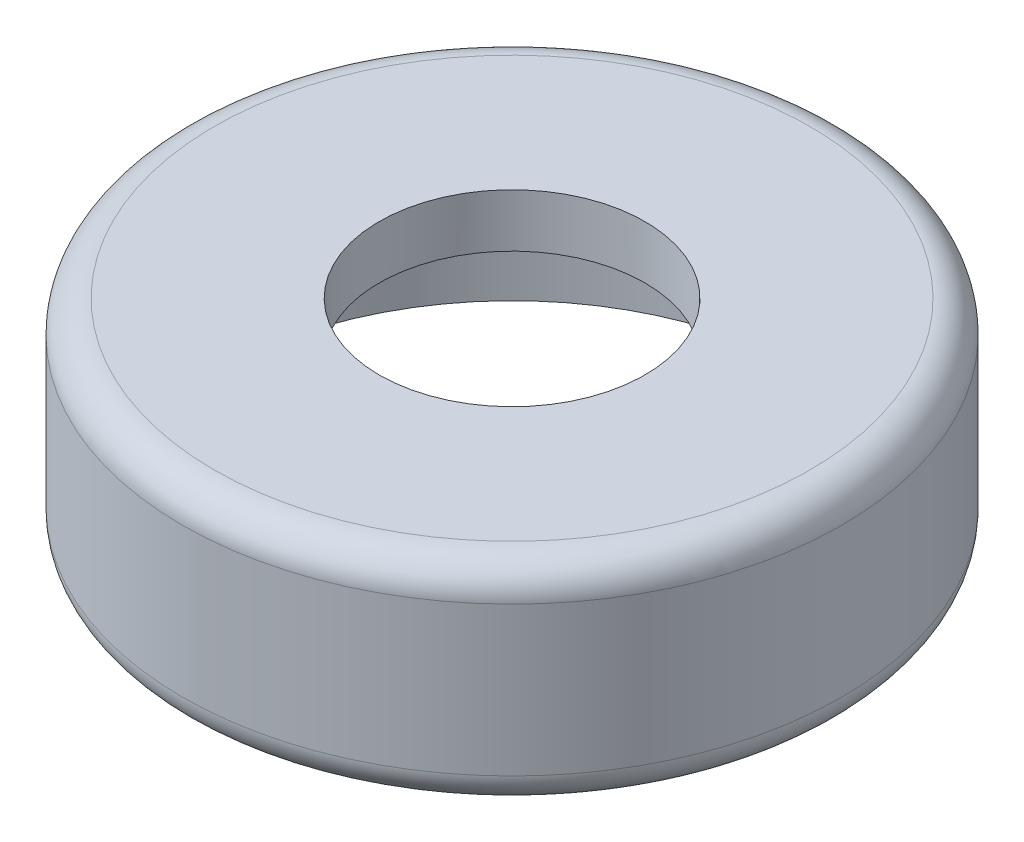
ISO-10303-21;
HEADER;
FILE_DESCRIPTION(('STEP AP214'),'2;1');
FILE_NAME('part.step','',(''),(''),'','','');
FILE_SCHEMA(('AUTOMOTIVE_DESIGN { 1 0 10303 214 1 1 1 1 }'));
ENDSEC;
DATA;
#1=APPLICATION_CONTEXT('core data for automotive mechanical design processes');
#2=APPLICATION_PROTOCOL_DEFINITION('international standard','automotive_design',2000,#1);
#3=PRODUCT_CONTEXT('',#1,'mechanical');
#4=PRODUCT('Part','Part','',(#3));
#5=PRODUCT_RELATED_PRODUCT_CATEGORY('part','',(#4));
#6=PRODUCT_DEFINITION_FORMATION('','',#4);
#7=PRODUCT_DEFINITION_CONTEXT('part definition',#1,'design');
#8=PRODUCT_DEFINITION('design','',#6,#7);
#9=PRODUCT_DEFINITION_SHAPE('','',#8);
#10=(LENGTH_UNIT() NAMED_UNIT(*) SI_UNIT(.MILLI.,.METRE.));
#11=(NAMED_UNIT(*) PLANE_ANGLE_UNIT() SI_UNIT($,.RADIAN.));
#12=(NAMED_UNIT(*) SI_UNIT($,.STERADIAN.) SOLID_ANGLE_UNIT());
#13=UNCERTAINTY_MEASURE_WITH_UNIT(LENGTH_MEASURE(1.E-05),#10,'distance_accuracy_value','');
#14=(GEOMETRIC_REPRESENTATION_CONTEXT(3) GLOBAL_UNCERTAINTY_ASSIGNED_CONTEXT((#13)) GLOBAL_UNIT_ASSIGNED_CONTEXT((#10,
#11,#12)) REPRESENTATION_CONTEXT('',''));
#15=CARTESIAN_POINT('',(0.,0.,0.));
#16=DIRECTION('',(0.,0.,1.));
#17=DIRECTION('',(1.,0.,0.));
#18=AXIS2_PLACEMENT_3D('',#15,#16,#17);
#19=CARTESIAN_POINT('',(0.,20.,0.));
#20=DIRECTION('',(0.,-1.,0.));
#21=DIRECTION('',(0.,0.,-1.));
#22=AXIS2_PLACEMENT_3D('',#19,#20,#21);
#23=CYLINDRICAL_SURFACE('',#22,31.);
#24=CARTESIAN_POINT('',(0.,17.,0.));
#25=DIRECTION('',(0.,1.,0.));
#26=DIRECTION('',(0.,0.,1.));
#27=AXIS2_PLACEMENT_3D('',#24,#25,#26);
#28=CIRCLE('',#27,31.);
#29=CARTESIAN_POINT('',(0.,17.,31.));
#30=VERTEX_POINT('',#29);
#31=EDGE_CURVE('E10',#30,#30,#28,.F.);
#32=ORIENTED_EDGE('',*,*,#31,.T.);
#33=EDGE_LOOP('',(#32));
#34=FACE_BOUND('',#33,.T.);
#35=CARTESIAN_POINT('',(0.,3.,0.));
#36=DIRECTION('',(0.,1.,0.));
#37=DIRECTION('',(0.,0.,1.));
#38=AXIS2_PLACEMENT_3D('',#35,#36,#37);
#39=CIRCLE('',#38,31.);
#40=CARTESIAN_POINT('',(0.,3.,31.));
#41=VERTEX_POINT('',#40);
#42=EDGE_CURVE('E40',#41,#41,#39,.T.);
#43=ORIENTED_EDGE('',*,*,#42,.T.);
#44=EDGE_LOOP('',(#43));
#45=FACE_BOUND('',#44,.T.);
#46=ADVANCED_FACE('F32',(#34,#45),#23,.T.);
#47=CARTESIAN_POINT('',(0.,20.,0.));
#48=DIRECTION('',(0.,1.,0.));
#49=DIRECTION('',(0.,0.,1.));
#50=AXIS2_PLACEMENT_3D('',#47,#48,#49);
#51=PLANE('',#50);
#52=CARTESIAN_POINT('',(0.,20.,0.));
#53=DIRECTION('',(0.,1.,0.));
#54=DIRECTION('',(0.,0.,1.));
#55=AXIS2_PLACEMENT_3D('',#52,#53,#54);
#56=CIRCLE('',#55,12.5);
#57=CARTESIAN_POINT('',(0.,20.,12.5));
#58=VERTEX_POINT('',#57);
#59=EDGE_CURVE('E53',#58,#58,#56,.T.);
#60=ORIENTED_EDGE('',*,*,#59,.F.);
#61=EDGE_LOOP('',(#60));
#62=FACE_BOUND('',#61,.T.);
#63=CARTESIAN_POINT('',(0.,20.,0.));
#64=DIRECTION('',(0.,1.,0.));
#65=DIRECTION('',(0.,0.,1.));
#66=AXIS2_PLACEMENT_3D('',#63,#64,#65);
#67=CIRCLE('',#66,28.);
#68=CARTESIAN_POINT('',(0.,20.,28.));
#69=VERTEX_POINT('',#68);
#70=EDGE_CURVE('E44',#69,#69,#67,.T.);
#71=ORIENTED_EDGE('',*,*,#70,.T.);
#72=EDGE_LOOP('',(#71));
#73=FACE_BOUND('',#72,.T.);
#74=ADVANCED_FACE('F82',(#62,#73),#51,.T.);
#75=CARTESIAN_POINT('',(0.,17.,0.));
#76=DIRECTION('',(0.,1.,0.));
#77=DIRECTION('',(0.,0.,1.));
#78=AXIS2_PLACEMENT_3D('',#75,#76,#77);
#79=TOROIDAL_SURFACE('',#78,28.,3.);
#80=ORIENTED_EDGE('',*,*,#31,.F.);
#81=EDGE_LOOP('',(#80));
#82=FACE_BOUND('',#81,.T.);
#83=ORIENTED_EDGE('',*,*,#70,.F.);
#84=EDGE_LOOP('',(#83));
#85=FACE_BOUND('',#84,.T.);
#86=ADVANCED_FACE('F78',(#82,#85),#79,.T.);
#87=CARTESIAN_POINT('',(0.,3.,0.));
#88=DIRECTION('',(0.,1.,0.));
#89=DIRECTION('',(0.,0.,1.));
#90=AXIS2_PLACEMENT_3D('',#87,#88,#89);
#91=TOROIDAL_SURFACE('',#90,28.,3.);
#92=CARTESIAN_POINT('',(0.,0.,0.));
#93=DIRECTION('',(0.,-1.,0.));
#94=DIRECTION('',(0.,0.,-1.));
#95=AXIS2_PLACEMENT_3D('',#92,#93,#94);
#96=CIRCLE('',#95,28.);
#97=CARTESIAN_POINT('',(0.,0.,-28.));
#98=VERTEX_POINT('',#97);
#99=EDGE_CURVE('E50',#98,#98,#96,.T.);
#100=ORIENTED_EDGE('',*,*,#99,.F.);
#101=EDGE_LOOP('',(#100));
#102=FACE_BOUND('',#101,.T.);
#103=ORIENTED_EDGE('',*,*,#42,.F.);
#104=EDGE_LOOP('',(#103));
#105=FACE_BOUND('',#104,.T.);
#106=ADVANCED_FACE('F34',(#102,#105),#91,.T.);
#107=CARTESIAN_POINT('',(0.,15.,0.));
#108=DIRECTION('',(0.,-1.,0.));
#109=DIRECTION('',(0.,0.,-1.));
#110=AXIS2_PLACEMENT_3D('',#107,#108,#109);
#111=CYLINDRICAL_SURFACE('',#110,28.);
#112=CARTESIAN_POINT('',(0.,15.,0.));
#113=DIRECTION('',(0.,-1.,0.));
#114=DIRECTION('',(0.,0.,-1.));
#115=AXIS2_PLACEMENT_3D('',#112,#113,#114);
#116=CIRCLE('',#115,28.);
#117=CARTESIAN_POINT('',(0.,15.,-28.));
#118=VERTEX_POINT('',#117);
#119=EDGE_CURVE('E49',#118,#118,#116,.T.);
#120=ORIENTED_EDGE('',*,*,#119,.F.);
#121=EDGE_LOOP('',(#120));
#122=FACE_BOUND('',#121,.T.);
#123=ORIENTED_EDGE('',*,*,#99,.T.);
#124=EDGE_LOOP('',(#123));
#125=FACE_BOUND('',#124,.T.);
#126=ADVANCED_FACE('F67',(#122,#125),#111,.F.);
#127=CARTESIAN_POINT('',(0.,15.,0.));
#128=DIRECTION('',(0.,-1.,0.));
#129=DIRECTION('',(0.,0.,-1.));
#130=AXIS2_PLACEMENT_3D('',#127,#128,#129);
#131=PLANE('',#130);
#132=CARTESIAN_POINT('',(0.,15.,0.));
#133=DIRECTION('',(0.,-1.,0.));
#134=DIRECTION('',(0.,0.,-1.));
#135=AXIS2_PLACEMENT_3D('',#132,#133,#134);
#136=CIRCLE('',#135,12.5);
#137=CARTESIAN_POINT('',(0.,15.,-12.5));
#138=VERTEX_POINT('',#137);
#139=EDGE_CURVE('E36',#138,#138,#136,.T.);
#140=ORIENTED_EDGE('',*,*,#139,.F.);
#141=EDGE_LOOP('',(#140));
#142=FACE_BOUND('',#141,.T.);
#143=ORIENTED_EDGE('',*,*,#119,.T.);
#144=EDGE_LOOP('',(#143));
#145=FACE_BOUND('',#144,.T.);
#146=ADVANCED_FACE('F64',(#142,#145),#131,.T.);
#147=CARTESIAN_POINT('',(0.,0.,0.));
#148=DIRECTION('',(0.,1.,0.));
#149=DIRECTION('',(0.,0.,1.));
#150=AXIS2_PLACEMENT_3D('',#147,#148,#149);
#151=CYLINDRICAL_SURFACE('',#150,12.5);
#152=ORIENTED_EDGE('',*,*,#59,.T.);
#153=EDGE_LOOP('',(#152));
#154=FACE_BOUND('',#153,.T.);
#155=ORIENTED_EDGE('',*,*,#139,.T.);
#156=EDGE_LOOP('',(#155));
#157=FACE_BOUND('',#156,.T.);
#158=ADVANCED_FACE('F62',(#154,#157),#151,.F.);
#159=CLOSED_SHELL('',(#46,#74,#86,#106,#126,#146,#158));
#160=MANIFOLD_SOLID_BREP('B2',#159);
#161=ADVANCED_BREP_SHAPE_REPRESENTATION('',(#18,#160),#14);
#162=SHAPE_DEFINITION_REPRESENTATION(#9,#161);
ENDSEC;
END-ISO-10303-21;
